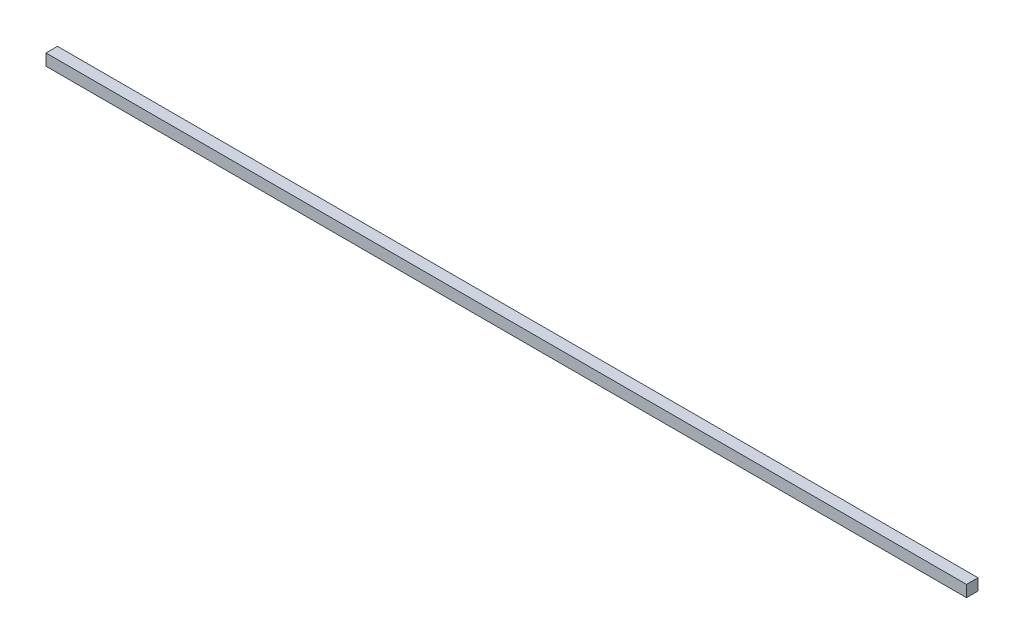
ISO-10303-21;
HEADER;
FILE_DESCRIPTION(('STEP AP214'),'2;1');
FILE_NAME('part.step','',(''),(''),'','','');
FILE_SCHEMA(('AUTOMOTIVE_DESIGN { 1 0 10303 214 1 1 1 1 }'));
ENDSEC;
DATA;
#1=APPLICATION_CONTEXT('core data for automotive mechanical design processes');
#2=APPLICATION_PROTOCOL_DEFINITION('international standard','automotive_design',2000,#1);
#3=PRODUCT_CONTEXT('',#1,'mechanical');
#4=PRODUCT('Part','Part','',(#3));
#5=PRODUCT_RELATED_PRODUCT_CATEGORY('part','',(#4));
#6=PRODUCT_DEFINITION_FORMATION('','',#4);
#7=PRODUCT_DEFINITION_CONTEXT('part definition',#1,'design');
#8=PRODUCT_DEFINITION('design','',#6,#7);
#9=PRODUCT_DEFINITION_SHAPE('','',#8);
#10=(LENGTH_UNIT() NAMED_UNIT(*) SI_UNIT(.MILLI.,.METRE.));
#11=(NAMED_UNIT(*) PLANE_ANGLE_UNIT() SI_UNIT($,.RADIAN.));
#12=(NAMED_UNIT(*) SI_UNIT($,.STERADIAN.) SOLID_ANGLE_UNIT());
#13=UNCERTAINTY_MEASURE_WITH_UNIT(LENGTH_MEASURE(1.E-05),#10,'distance_accuracy_value','');
#14=(GEOMETRIC_REPRESENTATION_CONTEXT(3) GLOBAL_UNCERTAINTY_ASSIGNED_CONTEXT((#13)) GLOBAL_UNIT_ASSIGNED_CONTEXT((#10,
#11,#12)) REPRESENTATION_CONTEXT('',''));
#15=CARTESIAN_POINT('',(0.,0.,0.));
#16=DIRECTION('',(0.,0.,1.));
#17=DIRECTION('',(1.,0.,0.));
#18=AXIS2_PLACEMENT_3D('',#15,#16,#17);
#19=CARTESIAN_POINT('',(10000.,-62.5,62.5));
#20=DIRECTION('',(0.,0.,-1.));
#21=DIRECTION('',(-1.,0.,0.));
#22=AXIS2_PLACEMENT_3D('',#19,#20,#21);
#23=PLANE('',#22);
#24=DIRECTION('',(0.,-1.,0.));
#25=VECTOR('',#24,1.);
#26=CARTESIAN_POINT('',(0.,-62.5,62.5));
#27=LINE('',#26,#25);
#28=CARTESIAN_POINT('',(0.,62.5,62.5));
#29=VERTEX_POINT('',#28);
#30=CARTESIAN_POINT('',(0.,-62.5,62.5));
#31=VERTEX_POINT('',#30);
#32=EDGE_CURVE('E101',#29,#31,#27,.T.);
#33=ORIENTED_EDGE('',*,*,#32,.T.);
#34=DIRECTION('',(-1.,0.,0.));
#35=VECTOR('',#34,1.);
#36=CARTESIAN_POINT('',(10000.,-62.5,62.5));
#37=LINE('',#36,#35);
#38=CARTESIAN_POINT('',(10000.,-62.5,62.5));
#39=VERTEX_POINT('',#38);
#40=EDGE_CURVE('E11',#39,#31,#37,.T.);
#41=ORIENTED_EDGE('',*,*,#40,.F.);
#42=DIRECTION('',(0.,-1.,0.));
#43=VECTOR('',#42,1.);
#44=CARTESIAN_POINT('',(10000.,-62.5,62.5));
#45=LINE('',#44,#43);
#46=CARTESIAN_POINT('',(10000.,62.5,62.5));
#47=VERTEX_POINT('',#46);
#48=EDGE_CURVE('E89',#47,#39,#45,.T.);
#49=ORIENTED_EDGE('',*,*,#48,.F.);
#50=DIRECTION('',(-1.,0.,0.));
#51=VECTOR('',#50,1.);
#52=CARTESIAN_POINT('',(10000.,62.5,62.5));
#53=LINE('',#52,#51);
#54=EDGE_CURVE('E97',#47,#29,#53,.T.);
#55=ORIENTED_EDGE('',*,*,#54,.T.);
#56=EDGE_LOOP('',(#33,#41,#49,#55));
#57=FACE_BOUND('',#56,.T.);
#58=ADVANCED_FACE('F38',(#57),#23,.F.);
#59=CARTESIAN_POINT('',(10000.,-62.5,-62.5));
#60=DIRECTION('',(0.,1.,0.));
#61=DIRECTION('',(0.,0.,1.));
#62=AXIS2_PLACEMENT_3D('',#59,#60,#61);
#63=PLANE('',#62);
#64=DIRECTION('',(0.,0.,-1.));
#65=VECTOR('',#64,1.);
#66=CARTESIAN_POINT('',(0.,-62.5,-62.5));
#67=LINE('',#66,#65);
#68=CARTESIAN_POINT('',(0.,-62.5,-62.5));
#69=VERTEX_POINT('',#68);
#70=EDGE_CURVE('E93',#31,#69,#67,.T.);
#71=ORIENTED_EDGE('',*,*,#70,.T.);
#72=DIRECTION('',(-1.,0.,0.));
#73=VECTOR('',#72,1.);
#74=CARTESIAN_POINT('',(10000.,-62.5,-62.5));
#75=LINE('',#74,#73);
#76=CARTESIAN_POINT('',(10000.,-62.5,-62.5));
#77=VERTEX_POINT('',#76);
#78=EDGE_CURVE('E46',#77,#69,#75,.T.);
#79=ORIENTED_EDGE('',*,*,#78,.F.);
#80=DIRECTION('',(0.,0.,-1.));
#81=VECTOR('',#80,1.);
#82=CARTESIAN_POINT('',(10000.,-62.5,-62.5));
#83=LINE('',#82,#81);
#84=EDGE_CURVE('E84',#39,#77,#83,.T.);
#85=ORIENTED_EDGE('',*,*,#84,.F.);
#86=ORIENTED_EDGE('',*,*,#40,.T.);
#87=EDGE_LOOP('',(#71,#79,#85,#86));
#88=FACE_BOUND('',#87,.T.);
#89=ADVANCED_FACE('F92',(#88),#63,.F.);
#90=CARTESIAN_POINT('',(10000.,-62.5,-62.5));
#91=DIRECTION('',(0.,0.,1.));
#92=DIRECTION('',(0.,-1.,0.));
#93=AXIS2_PLACEMENT_3D('',#90,#91,#92);
#94=PLANE('',#93);
#95=DIRECTION('',(0.,1.,0.));
#96=VECTOR('',#95,1.);
#97=CARTESIAN_POINT('',(0.,-62.5,-62.5));
#98=LINE('',#97,#96);
#99=CARTESIAN_POINT('',(0.,62.5,-62.5));
#100=VERTEX_POINT('',#99);
#101=EDGE_CURVE('E71',#69,#100,#98,.T.);
#102=ORIENTED_EDGE('',*,*,#101,.T.);
#103=DIRECTION('',(-1.,0.,0.));
#104=VECTOR('',#103,1.);
#105=CARTESIAN_POINT('',(10000.,62.5,-62.5));
#106=LINE('',#105,#104);
#107=CARTESIAN_POINT('',(10000.,62.5,-62.5));
#108=VERTEX_POINT('',#107);
#109=EDGE_CURVE('E94',#108,#100,#106,.T.);
#110=ORIENTED_EDGE('',*,*,#109,.F.);
#111=DIRECTION('',(0.,1.,0.));
#112=VECTOR('',#111,1.);
#113=CARTESIAN_POINT('',(10000.,-62.5,-62.5));
#114=LINE('',#113,#112);
#115=EDGE_CURVE('E87',#77,#108,#114,.T.);
#116=ORIENTED_EDGE('',*,*,#115,.F.);
#117=ORIENTED_EDGE('',*,*,#78,.T.);
#118=EDGE_LOOP('',(#102,#110,#116,#117));
#119=FACE_BOUND('',#118,.T.);
#120=ADVANCED_FACE('F95',(#119),#94,.F.);
#121=CARTESIAN_POINT('',(10000.,62.5,-62.5));
#122=DIRECTION('',(0.,-1.,0.));
#123=DIRECTION('',(0.,0.,-1.));
#124=AXIS2_PLACEMENT_3D('',#121,#122,#123);
#125=PLANE('',#124);
#126=DIRECTION('',(0.,0.,1.));
#127=VECTOR('',#126,1.);
#128=CARTESIAN_POINT('',(0.,62.5,-62.5));
#129=LINE('',#128,#127);
#130=EDGE_CURVE('E77',#100,#29,#129,.T.);
#131=ORIENTED_EDGE('',*,*,#130,.T.);
#132=ORIENTED_EDGE('',*,*,#54,.F.);
#133=DIRECTION('',(0.,0.,1.));
#134=VECTOR('',#133,1.);
#135=CARTESIAN_POINT('',(10000.,62.5,-62.5));
#136=LINE('',#135,#134);
#137=EDGE_CURVE('E54',#108,#47,#136,.T.);
#138=ORIENTED_EDGE('',*,*,#137,.F.);
#139=ORIENTED_EDGE('',*,*,#109,.T.);
#140=EDGE_LOOP('',(#131,#132,#138,#139));
#141=FACE_BOUND('',#140,.T.);
#142=ADVANCED_FACE('F108',(#141),#125,.F.);
#143=CARTESIAN_POINT('',(10000.,62.5,62.5));
#144=DIRECTION('',(1.,0.,0.));
#145=DIRECTION('',(0.,0.,-1.));
#146=AXIS2_PLACEMENT_3D('',#143,#144,#145);
#147=PLANE('',#146);
#148=ORIENTED_EDGE('',*,*,#48,.T.);
#149=ORIENTED_EDGE('',*,*,#84,.T.);
#150=ORIENTED_EDGE('',*,*,#115,.T.);
#151=ORIENTED_EDGE('',*,*,#137,.T.);
#152=EDGE_LOOP('',(#148,#149,#150,#151));
#153=FACE_BOUND('',#152,.T.);
#154=ADVANCED_FACE('F85',(#153),#147,.T.);
#155=CARTESIAN_POINT('',(0.,62.5,62.5));
#156=DIRECTION('',(1.,0.,0.));
#157=DIRECTION('',(0.,0.,-1.));
#158=AXIS2_PLACEMENT_3D('',#155,#156,#157);
#159=PLANE('',#158);
#160=ORIENTED_EDGE('',*,*,#32,.F.);
#161=ORIENTED_EDGE('',*,*,#130,.F.);
#162=ORIENTED_EDGE('',*,*,#101,.F.);
#163=ORIENTED_EDGE('',*,*,#70,.F.);
#164=EDGE_LOOP('',(#160,#161,#162,#163));
#165=FACE_BOUND('',#164,.T.);
#166=ADVANCED_FACE('F111',(#165),#159,.F.);
#167=CLOSED_SHELL('',(#58,#89,#120,#142,#154,#166));
#168=MANIFOLD_SOLID_BREP('B2',#167);
#169=ADVANCED_BREP_SHAPE_REPRESENTATION('',(#18,#168),#14);
#170=SHAPE_DEFINITION_REPRESENTATION(#9,#169);
ENDSEC;
END-ISO-10303-21;
